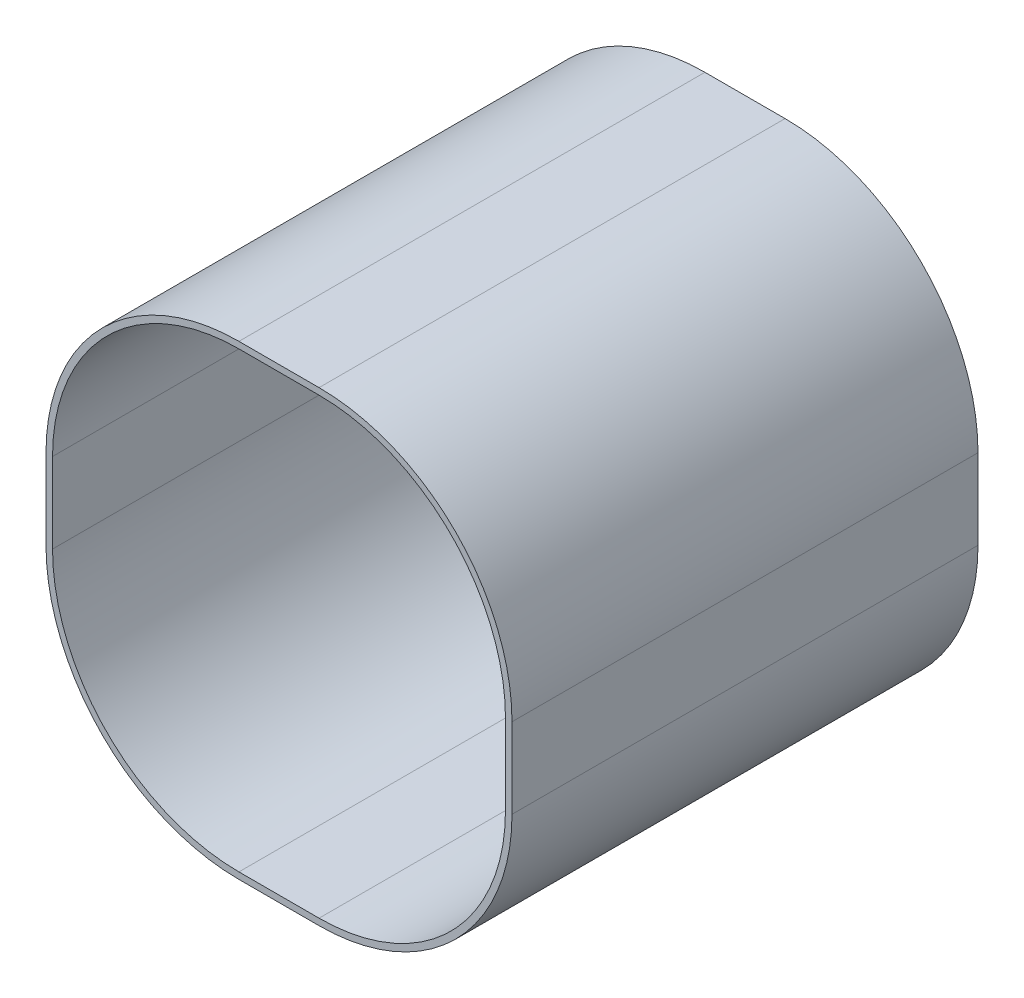
ISO-10303-21;
HEADER;
FILE_DESCRIPTION(('STEP AP214'),'2;1');
FILE_NAME('part.step','',(''),(''),'','','');
FILE_SCHEMA(('AUTOMOTIVE_DESIGN { 1 0 10303 214 1 1 1 1 }'));
ENDSEC;
DATA;
#1=APPLICATION_CONTEXT('core data for automotive mechanical design processes');
#2=APPLICATION_PROTOCOL_DEFINITION('international standard','automotive_design',2000,#1);
#3=PRODUCT_CONTEXT('',#1,'mechanical');
#4=PRODUCT('Part','Part','',(#3));
#5=PRODUCT_RELATED_PRODUCT_CATEGORY('part','',(#4));
#6=PRODUCT_DEFINITION_FORMATION('','',#4);
#7=PRODUCT_DEFINITION_CONTEXT('part definition',#1,'design');
#8=PRODUCT_DEFINITION('design','',#6,#7);
#9=PRODUCT_DEFINITION_SHAPE('','',#8);
#10=(LENGTH_UNIT() NAMED_UNIT(*) SI_UNIT(.MILLI.,.METRE.));
#11=(NAMED_UNIT(*) PLANE_ANGLE_UNIT() SI_UNIT($,.RADIAN.));
#12=(NAMED_UNIT(*) SI_UNIT($,.STERADIAN.) SOLID_ANGLE_UNIT());
#13=UNCERTAINTY_MEASURE_WITH_UNIT(LENGTH_MEASURE(1.E-05),#10,'distance_accuracy_value','');
#14=(GEOMETRIC_REPRESENTATION_CONTEXT(3) GLOBAL_UNCERTAINTY_ASSIGNED_CONTEXT((#13)) GLOBAL_UNIT_ASSIGNED_CONTEXT((#10,
#11,#12)) REPRESENTATION_CONTEXT('',''));
#15=CARTESIAN_POINT('',(0.,0.,0.));
#16=DIRECTION('',(0.,0.,1.));
#17=DIRECTION('',(1.,0.,0.));
#18=AXIS2_PLACEMENT_3D('',#15,#16,#17);
#19=CARTESIAN_POINT('',(0.,0.,25.));
#20=DIRECTION('',(0.,0.,1.));
#21=DIRECTION('',(1.,0.,0.));
#22=AXIS2_PLACEMENT_3D('',#19,#20,#21);
#23=PLANE('',#22);
#24=DIRECTION('',(0.,1.,0.));
#25=VECTOR('',#24,1.);
#26=CARTESIAN_POINT('',(12.5,12.5,25.));
#27=LINE('',#26,#25);
#28=CARTESIAN_POINT('',(12.5,-2.15,25.));
#29=VERTEX_POINT('',#28);
#30=CARTESIAN_POINT('',(12.5,2.15,25.));
#31=VERTEX_POINT('',#30);
#32=EDGE_CURVE('E251',#29,#31,#27,.T.);
#33=ORIENTED_EDGE('',*,*,#32,.T.);
#34=CARTESIAN_POINT('',(2.15,2.15,25.));
#35=DIRECTION('',(0.,0.,1.));
#36=DIRECTION('',(1.,0.,0.));
#37=AXIS2_PLACEMENT_3D('',#34,#35,#36);
#38=CIRCLE('',#37,10.35);
#39=CARTESIAN_POINT('',(2.15,12.5,25.));
#40=VERTEX_POINT('',#39);
#41=EDGE_CURVE('E230',#31,#40,#38,.T.);
#42=ORIENTED_EDGE('',*,*,#41,.T.);
#43=DIRECTION('',(-1.,0.,0.));
#44=VECTOR('',#43,1.);
#45=CARTESIAN_POINT('',(-12.5,12.5,25.));
#46=LINE('',#45,#44);
#47=CARTESIAN_POINT('',(-2.15,12.5,25.));
#48=VERTEX_POINT('',#47);
#49=EDGE_CURVE('E259',#40,#48,#46,.T.);
#50=ORIENTED_EDGE('',*,*,#49,.T.);
#51=CARTESIAN_POINT('',(-2.15,2.15,25.));
#52=DIRECTION('',(0.,0.,1.));
#53=DIRECTION('',(1.,0.,0.));
#54=AXIS2_PLACEMENT_3D('',#51,#52,#53);
#55=CIRCLE('',#54,10.35);
#56=CARTESIAN_POINT('',(-12.5,2.14999999999999,25.));
#57=VERTEX_POINT('',#56);
#58=EDGE_CURVE('E225',#48,#57,#55,.T.);
#59=ORIENTED_EDGE('',*,*,#58,.T.);
#60=DIRECTION('',(0.,-1.,0.));
#61=VECTOR('',#60,1.);
#62=CARTESIAN_POINT('',(-12.5,12.5,25.));
#63=LINE('',#62,#61);
#64=CARTESIAN_POINT('',(-12.5,-2.15000000000001,25.));
#65=VERTEX_POINT('',#64);
#66=EDGE_CURVE('E176',#57,#65,#63,.T.);
#67=ORIENTED_EDGE('',*,*,#66,.T.);
#68=CARTESIAN_POINT('',(-2.15,-2.15000000000001,25.));
#69=DIRECTION('',(0.,0.,1.));
#70=DIRECTION('',(1.,0.,0.));
#71=AXIS2_PLACEMENT_3D('',#68,#69,#70);
#72=CIRCLE('',#71,10.35);
#73=CARTESIAN_POINT('',(-2.15,-12.5,25.));
#74=VERTEX_POINT('',#73);
#75=EDGE_CURVE('E55',#65,#74,#72,.T.);
#76=ORIENTED_EDGE('',*,*,#75,.T.);
#77=DIRECTION('',(1.,0.,0.));
#78=VECTOR('',#77,1.);
#79=CARTESIAN_POINT('',(-12.5,-12.5,25.));
#80=LINE('',#79,#78);
#81=CARTESIAN_POINT('',(2.15,-12.5,25.));
#82=VERTEX_POINT('',#81);
#83=EDGE_CURVE('E172',#74,#82,#80,.T.);
#84=ORIENTED_EDGE('',*,*,#83,.T.);
#85=CARTESIAN_POINT('',(2.15,-2.15000000000001,25.));
#86=DIRECTION('',(0.,0.,1.));
#87=DIRECTION('',(1.,0.,0.));
#88=AXIS2_PLACEMENT_3D('',#85,#86,#87);
#89=CIRCLE('',#88,10.35);
#90=EDGE_CURVE('E228',#82,#29,#89,.T.);
#91=ORIENTED_EDGE('',*,*,#90,.T.);
#92=EDGE_LOOP('',(#33,#42,#50,#59,#67,#76,#84,#91));
#93=FACE_BOUND('',#92,.T.);
#94=DIRECTION('',(-1.,0.,0.));
#95=VECTOR('',#94,1.);
#96=CARTESIAN_POINT('',(-12.15,12.15,25.));
#97=LINE('',#96,#95);
#98=CARTESIAN_POINT('',(2.15,12.15,25.));
#99=VERTEX_POINT('',#98);
#100=CARTESIAN_POINT('',(-2.15,12.15,25.));
#101=VERTEX_POINT('',#100);
#102=EDGE_CURVE('E275',#99,#101,#97,.T.);
#103=ORIENTED_EDGE('',*,*,#102,.F.);
#104=CARTESIAN_POINT('',(2.15,2.15,25.));
#105=DIRECTION('',(0.,0.,1.));
#106=DIRECTION('',(1.,0.,0.));
#107=AXIS2_PLACEMENT_3D('',#104,#105,#106);
#108=CIRCLE('',#107,10.);
#109=CARTESIAN_POINT('',(12.15,2.15,25.));
#110=VERTEX_POINT('',#109);
#111=EDGE_CURVE('E201',#99,#110,#108,.F.);
#112=ORIENTED_EDGE('',*,*,#111,.T.);
#113=DIRECTION('',(0.,1.,0.));
#114=VECTOR('',#113,1.);
#115=CARTESIAN_POINT('',(12.15,12.15,25.));
#116=LINE('',#115,#114);
#117=CARTESIAN_POINT('',(12.15,-2.15,25.));
#118=VERTEX_POINT('',#117);
#119=EDGE_CURVE('E168',#118,#110,#116,.T.);
#120=ORIENTED_EDGE('',*,*,#119,.F.);
#121=CARTESIAN_POINT('',(2.15,-2.15,25.));
#122=DIRECTION('',(0.,0.,1.));
#123=DIRECTION('',(1.,0.,0.));
#124=AXIS2_PLACEMENT_3D('',#121,#122,#123);
#125=CIRCLE('',#124,10.);
#126=CARTESIAN_POINT('',(2.15,-12.15,25.));
#127=VERTEX_POINT('',#126);
#128=EDGE_CURVE('E197',#118,#127,#125,.F.);
#129=ORIENTED_EDGE('',*,*,#128,.T.);
#130=DIRECTION('',(1.,0.,0.));
#131=VECTOR('',#130,1.);
#132=CARTESIAN_POINT('',(-12.15,-12.15,25.));
#133=LINE('',#132,#131);
#134=CARTESIAN_POINT('',(-2.15,-12.15,25.));
#135=VERTEX_POINT('',#134);
#136=EDGE_CURVE('E256',#135,#127,#133,.T.);
#137=ORIENTED_EDGE('',*,*,#136,.F.);
#138=CARTESIAN_POINT('',(-2.15,-2.15,25.));
#139=DIRECTION('',(0.,0.,1.));
#140=DIRECTION('',(1.,0.,0.));
#141=AXIS2_PLACEMENT_3D('',#138,#139,#140);
#142=CIRCLE('',#141,10.);
#143=CARTESIAN_POINT('',(-12.15,-2.15,25.));
#144=VERTEX_POINT('',#143);
#145=EDGE_CURVE('E157',#135,#144,#142,.F.);
#146=ORIENTED_EDGE('',*,*,#145,.T.);
#147=DIRECTION('',(0.,-1.,0.));
#148=VECTOR('',#147,1.);
#149=CARTESIAN_POINT('',(-12.15,12.15,25.));
#150=LINE('',#149,#148);
#151=CARTESIAN_POINT('',(-12.15,2.14999999999999,25.));
#152=VERTEX_POINT('',#151);
#153=EDGE_CURVE('E272',#152,#144,#150,.T.);
#154=ORIENTED_EDGE('',*,*,#153,.F.);
#155=CARTESIAN_POINT('',(-2.15,2.15,25.));
#156=DIRECTION('',(0.,0.,1.));
#157=DIRECTION('',(1.,0.,0.));
#158=AXIS2_PLACEMENT_3D('',#155,#156,#157);
#159=CIRCLE('',#158,10.);
#160=EDGE_CURVE('E158',#152,#101,#159,.F.);
#161=ORIENTED_EDGE('',*,*,#160,.T.);
#162=EDGE_LOOP('',(#103,#112,#120,#129,#137,#146,#154,#161));
#163=FACE_BOUND('',#162,.T.);
#164=ADVANCED_FACE('F33',(#93,#163),#23,.T.);
#165=CARTESIAN_POINT('',(0.,0.,0.));
#166=DIRECTION('',(0.,0.,1.));
#167=DIRECTION('',(1.,0.,0.));
#168=AXIS2_PLACEMENT_3D('',#165,#166,#167);
#169=PLANE('',#168);
#170=DIRECTION('',(-1.,0.,0.));
#171=VECTOR('',#170,1.);
#172=CARTESIAN_POINT('',(-12.5,12.5,0.));
#173=LINE('',#172,#171);
#174=CARTESIAN_POINT('',(2.15,12.5,0.));
#175=VERTEX_POINT('',#174);
#176=CARTESIAN_POINT('',(-2.15,12.5,0.));
#177=VERTEX_POINT('',#176);
#178=EDGE_CURVE('E250',#175,#177,#173,.T.);
#179=ORIENTED_EDGE('',*,*,#178,.F.);
#180=CARTESIAN_POINT('',(2.15,2.15,0.));
#181=DIRECTION('',(0.,0.,1.));
#182=DIRECTION('',(1.,0.,0.));
#183=AXIS2_PLACEMENT_3D('',#180,#181,#182);
#184=CIRCLE('',#183,10.35);
#185=CARTESIAN_POINT('',(12.5,2.15,0.));
#186=VERTEX_POINT('',#185);
#187=EDGE_CURVE('E218',#175,#186,#184,.F.);
#188=ORIENTED_EDGE('',*,*,#187,.T.);
#189=DIRECTION('',(0.,1.,0.));
#190=VECTOR('',#189,1.);
#191=CARTESIAN_POINT('',(12.5,12.5,0.));
#192=LINE('',#191,#190);
#193=CARTESIAN_POINT('',(12.5,-2.15,0.));
#194=VERTEX_POINT('',#193);
#195=EDGE_CURVE('E252',#194,#186,#192,.T.);
#196=ORIENTED_EDGE('',*,*,#195,.F.);
#197=CARTESIAN_POINT('',(2.15,-2.15000000000001,0.));
#198=DIRECTION('',(0.,0.,1.));
#199=DIRECTION('',(1.,0.,0.));
#200=AXIS2_PLACEMENT_3D('',#197,#198,#199);
#201=CIRCLE('',#200,10.35);
#202=CARTESIAN_POINT('',(2.15,-12.5,0.));
#203=VERTEX_POINT('',#202);
#204=EDGE_CURVE('E216',#194,#203,#201,.F.);
#205=ORIENTED_EDGE('',*,*,#204,.T.);
#206=DIRECTION('',(1.,0.,0.));
#207=VECTOR('',#206,1.);
#208=CARTESIAN_POINT('',(-12.5,-12.5,0.));
#209=LINE('',#208,#207);
#210=CARTESIAN_POINT('',(-2.15,-12.5,0.));
#211=VERTEX_POINT('',#210);
#212=EDGE_CURVE('E179',#211,#203,#209,.T.);
#213=ORIENTED_EDGE('',*,*,#212,.F.);
#214=CARTESIAN_POINT('',(-2.15,-2.15000000000001,0.));
#215=DIRECTION('',(0.,0.,1.));
#216=DIRECTION('',(1.,0.,0.));
#217=AXIS2_PLACEMENT_3D('',#214,#215,#216);
#218=CIRCLE('',#217,10.35);
#219=CARTESIAN_POINT('',(-12.5,-2.15000000000001,0.));
#220=VERTEX_POINT('',#219);
#221=EDGE_CURVE('E214',#211,#220,#218,.F.);
#222=ORIENTED_EDGE('',*,*,#221,.T.);
#223=DIRECTION('',(0.,-1.,0.));
#224=VECTOR('',#223,1.);
#225=CARTESIAN_POINT('',(-12.5,12.5,0.));
#226=LINE('',#225,#224);
#227=CARTESIAN_POINT('',(-12.5,2.14999999999999,0.));
#228=VERTEX_POINT('',#227);
#229=EDGE_CURVE('E242',#228,#220,#226,.T.);
#230=ORIENTED_EDGE('',*,*,#229,.F.);
#231=CARTESIAN_POINT('',(-2.15,2.15,0.));
#232=DIRECTION('',(0.,0.,1.));
#233=DIRECTION('',(1.,0.,0.));
#234=AXIS2_PLACEMENT_3D('',#231,#232,#233);
#235=CIRCLE('',#234,10.35);
#236=EDGE_CURVE('E212',#228,#177,#235,.F.);
#237=ORIENTED_EDGE('',*,*,#236,.T.);
#238=EDGE_LOOP('',(#179,#188,#196,#205,#213,#222,#230,#237));
#239=FACE_BOUND('',#238,.T.);
#240=DIRECTION('',(1.,0.,0.));
#241=VECTOR('',#240,1.);
#242=CARTESIAN_POINT('',(-12.15,-12.15,0.));
#243=LINE('',#242,#241);
#244=CARTESIAN_POINT('',(-2.15,-12.15,0.));
#245=VERTEX_POINT('',#244);
#246=CARTESIAN_POINT('',(2.15,-12.15,0.));
#247=VERTEX_POINT('',#246);
#248=EDGE_CURVE('E150',#245,#247,#243,.T.);
#249=ORIENTED_EDGE('',*,*,#248,.T.);
#250=CARTESIAN_POINT('',(2.15,-2.15,0.));
#251=DIRECTION('',(0.,0.,1.));
#252=DIRECTION('',(1.,0.,0.));
#253=AXIS2_PLACEMENT_3D('',#250,#251,#252);
#254=CIRCLE('',#253,10.);
#255=CARTESIAN_POINT('',(12.15,-2.15,0.));
#256=VERTEX_POINT('',#255);
#257=EDGE_CURVE('E195',#247,#256,#254,.T.);
#258=ORIENTED_EDGE('',*,*,#257,.T.);
#259=DIRECTION('',(0.,1.,0.));
#260=VECTOR('',#259,1.);
#261=CARTESIAN_POINT('',(12.15,12.15,0.));
#262=LINE('',#261,#260);
#263=CARTESIAN_POINT('',(12.15,2.15,0.));
#264=VERTEX_POINT('',#263);
#265=EDGE_CURVE('E268',#256,#264,#262,.T.);
#266=ORIENTED_EDGE('',*,*,#265,.T.);
#267=CARTESIAN_POINT('',(2.15,2.15,0.));
#268=DIRECTION('',(0.,0.,1.));
#269=DIRECTION('',(1.,0.,0.));
#270=AXIS2_PLACEMENT_3D('',#267,#268,#269);
#271=CIRCLE('',#270,10.);
#272=CARTESIAN_POINT('',(2.15,12.15,0.));
#273=VERTEX_POINT('',#272);
#274=EDGE_CURVE('E199',#264,#273,#271,.T.);
#275=ORIENTED_EDGE('',*,*,#274,.T.);
#276=DIRECTION('',(-1.,0.,0.));
#277=VECTOR('',#276,1.);
#278=CARTESIAN_POINT('',(-12.15,12.15,0.));
#279=LINE('',#278,#277);
#280=CARTESIAN_POINT('',(-2.15,12.15,0.));
#281=VERTEX_POINT('',#280);
#282=EDGE_CURVE('E265',#273,#281,#279,.T.);
#283=ORIENTED_EDGE('',*,*,#282,.T.);
#284=CARTESIAN_POINT('',(-2.15,2.15,0.));
#285=DIRECTION('',(0.,0.,1.));
#286=DIRECTION('',(1.,0.,0.));
#287=AXIS2_PLACEMENT_3D('',#284,#285,#286);
#288=CIRCLE('',#287,10.);
#289=CARTESIAN_POINT('',(-12.15,2.14999999999999,0.));
#290=VERTEX_POINT('',#289);
#291=EDGE_CURVE('E203',#281,#290,#288,.T.);
#292=ORIENTED_EDGE('',*,*,#291,.T.);
#293=DIRECTION('',(0.,-1.,0.));
#294=VECTOR('',#293,1.);
#295=CARTESIAN_POINT('',(-12.15,12.15,0.));
#296=LINE('',#295,#294);
#297=CARTESIAN_POINT('',(-12.15,-2.15,0.));
#298=VERTEX_POINT('',#297);
#299=EDGE_CURVE('E152',#290,#298,#296,.T.);
#300=ORIENTED_EDGE('',*,*,#299,.T.);
#301=CARTESIAN_POINT('',(-2.15,-2.15,0.));
#302=DIRECTION('',(0.,0.,1.));
#303=DIRECTION('',(1.,0.,0.));
#304=AXIS2_PLACEMENT_3D('',#301,#302,#303);
#305=CIRCLE('',#304,10.);
#306=EDGE_CURVE('E147',#298,#245,#305,.T.);
#307=ORIENTED_EDGE('',*,*,#306,.T.);
#308=EDGE_LOOP('',(#249,#258,#266,#275,#283,#292,#300,#307));
#309=FACE_BOUND('',#308,.T.);
#310=ADVANCED_FACE('F149',(#239,#309),#169,.F.);
#311=CARTESIAN_POINT('',(12.5,12.5,25.));
#312=DIRECTION('',(-1.,0.,0.));
#313=DIRECTION('',(0.,-1.,0.));
#314=AXIS2_PLACEMENT_3D('',#311,#312,#313);
#315=PLANE('',#314);
#316=ORIENTED_EDGE('',*,*,#195,.T.);
#317=DIRECTION('',(0.,0.,-1.));
#318=VECTOR('',#317,1.);
#319=CARTESIAN_POINT('',(12.5,2.15,25.));
#320=LINE('',#319,#318);
#321=EDGE_CURVE('E223',#186,#31,#320,.F.);
#322=ORIENTED_EDGE('',*,*,#321,.T.);
#323=ORIENTED_EDGE('',*,*,#32,.F.);
#324=DIRECTION('',(0.,0.,-1.));
#325=VECTOR('',#324,1.);
#326=CARTESIAN_POINT('',(12.5,-2.15,25.));
#327=LINE('',#326,#325);
#328=EDGE_CURVE('E220',#29,#194,#327,.T.);
#329=ORIENTED_EDGE('',*,*,#328,.T.);
#330=EDGE_LOOP('',(#316,#322,#323,#329));
#331=FACE_BOUND('',#330,.T.);
#332=ADVANCED_FACE('F321',(#331),#315,.F.);
#333=CARTESIAN_POINT('',(-12.5,12.5,25.));
#334=DIRECTION('',(0.,-1.,0.));
#335=DIRECTION('',(0.,0.,-1.));
#336=AXIS2_PLACEMENT_3D('',#333,#334,#335);
#337=PLANE('',#336);
#338=ORIENTED_EDGE('',*,*,#49,.F.);
#339=DIRECTION('',(0.,0.,-1.));
#340=VECTOR('',#339,1.);
#341=CARTESIAN_POINT('',(2.15,12.5,25.));
#342=LINE('',#341,#340);
#343=EDGE_CURVE('E209',#40,#175,#342,.T.);
#344=ORIENTED_EDGE('',*,*,#343,.T.);
#345=ORIENTED_EDGE('',*,*,#178,.T.);
#346=DIRECTION('',(0.,0.,-1.));
#347=VECTOR('',#346,1.);
#348=CARTESIAN_POINT('',(-2.15,12.5,25.));
#349=LINE('',#348,#347);
#350=EDGE_CURVE('E207',#177,#48,#349,.F.);
#351=ORIENTED_EDGE('',*,*,#350,.T.);
#352=EDGE_LOOP('',(#338,#344,#345,#351));
#353=FACE_BOUND('',#352,.T.);
#354=ADVANCED_FACE('F331',(#353),#337,.F.);
#355=CARTESIAN_POINT('',(-12.5,12.5,25.));
#356=DIRECTION('',(1.,0.,0.));
#357=DIRECTION('',(0.,1.,0.));
#358=AXIS2_PLACEMENT_3D('',#355,#356,#357);
#359=PLANE('',#358);
#360=ORIENTED_EDGE('',*,*,#229,.T.);
#361=DIRECTION('',(0.,0.,-1.));
#362=VECTOR('',#361,1.);
#363=CARTESIAN_POINT('',(-12.5,-2.15000000000001,25.));
#364=LINE('',#363,#362);
#365=EDGE_CURVE('E11',#220,#65,#364,.F.);
#366=ORIENTED_EDGE('',*,*,#365,.T.);
#367=ORIENTED_EDGE('',*,*,#66,.F.);
#368=DIRECTION('',(0.,0.,-1.));
#369=VECTOR('',#368,1.);
#370=CARTESIAN_POINT('',(-12.5,2.14999999999999,25.));
#371=LINE('',#370,#369);
#372=EDGE_CURVE('E41',#57,#228,#371,.T.);
#373=ORIENTED_EDGE('',*,*,#372,.T.);
#374=EDGE_LOOP('',(#360,#366,#367,#373));
#375=FACE_BOUND('',#374,.T.);
#376=ADVANCED_FACE('F241',(#375),#359,.F.);
#377=CARTESIAN_POINT('',(-12.5,-12.5,25.));
#378=DIRECTION('',(0.,1.,0.));
#379=DIRECTION('',(0.,0.,1.));
#380=AXIS2_PLACEMENT_3D('',#377,#378,#379);
#381=PLANE('',#380);
#382=ORIENTED_EDGE('',*,*,#212,.T.);
#383=DIRECTION('',(0.,0.,-1.));
#384=VECTOR('',#383,1.);
#385=CARTESIAN_POINT('',(2.15,-12.5,25.));
#386=LINE('',#385,#384);
#387=EDGE_CURVE('E48',#203,#82,#386,.F.);
#388=ORIENTED_EDGE('',*,*,#387,.T.);
#389=ORIENTED_EDGE('',*,*,#83,.F.);
#390=DIRECTION('',(0.,0.,-1.));
#391=VECTOR('',#390,1.);
#392=CARTESIAN_POINT('',(-2.15,-12.5,25.));
#393=LINE('',#392,#391);
#394=EDGE_CURVE('E232',#74,#211,#393,.T.);
#395=ORIENTED_EDGE('',*,*,#394,.T.);
#396=EDGE_LOOP('',(#382,#388,#389,#395));
#397=FACE_BOUND('',#396,.T.);
#398=ADVANCED_FACE('F326',(#397),#381,.F.);
#399=CARTESIAN_POINT('',(12.15,12.15,25.));
#400=DIRECTION('',(-1.,0.,0.));
#401=DIRECTION('',(0.,-1.,0.));
#402=AXIS2_PLACEMENT_3D('',#399,#400,#401);
#403=PLANE('',#402);
#404=ORIENTED_EDGE('',*,*,#265,.F.);
#405=DIRECTION('',(0.,0.,-1.));
#406=VECTOR('',#405,1.);
#407=CARTESIAN_POINT('',(12.15,-2.15,25.));
#408=LINE('',#407,#406);
#409=EDGE_CURVE('E184',#256,#118,#408,.F.);
#410=ORIENTED_EDGE('',*,*,#409,.T.);
#411=ORIENTED_EDGE('',*,*,#119,.T.);
#412=DIRECTION('',(0.,0.,-1.));
#413=VECTOR('',#412,1.);
#414=CARTESIAN_POINT('',(12.15,2.15,0.));
#415=LINE('',#414,#413);
#416=EDGE_CURVE('E174',#110,#264,#415,.T.);
#417=ORIENTED_EDGE('',*,*,#416,.T.);
#418=EDGE_LOOP('',(#404,#410,#411,#417));
#419=FACE_BOUND('',#418,.T.);
#420=ADVANCED_FACE('F283',(#419),#403,.T.);
#421=CARTESIAN_POINT('',(-12.15,12.15,25.));
#422=DIRECTION('',(0.,-1.,0.));
#423=DIRECTION('',(0.,0.,-1.));
#424=AXIS2_PLACEMENT_3D('',#421,#422,#423);
#425=PLANE('',#424);
#426=ORIENTED_EDGE('',*,*,#282,.F.);
#427=DIRECTION('',(0.,0.,-1.));
#428=VECTOR('',#427,1.);
#429=CARTESIAN_POINT('',(2.15,12.15,25.));
#430=LINE('',#429,#428);
#431=EDGE_CURVE('E189',#273,#99,#430,.F.);
#432=ORIENTED_EDGE('',*,*,#431,.T.);
#433=ORIENTED_EDGE('',*,*,#102,.T.);
#434=DIRECTION('',(0.,0.,-1.));
#435=VECTOR('',#434,1.);
#436=CARTESIAN_POINT('',(-2.15,12.15,0.));
#437=LINE('',#436,#435);
#438=EDGE_CURVE('E186',#101,#281,#437,.T.);
#439=ORIENTED_EDGE('',*,*,#438,.T.);
#440=EDGE_LOOP('',(#426,#432,#433,#439));
#441=FACE_BOUND('',#440,.T.);
#442=ADVANCED_FACE('F293',(#441),#425,.T.);
#443=CARTESIAN_POINT('',(-12.15,12.15,25.));
#444=DIRECTION('',(1.,0.,0.));
#445=DIRECTION('',(0.,1.,0.));
#446=AXIS2_PLACEMENT_3D('',#443,#444,#445);
#447=PLANE('',#446);
#448=ORIENTED_EDGE('',*,*,#299,.F.);
#449=DIRECTION('',(0.,0.,-1.));
#450=VECTOR('',#449,1.);
#451=CARTESIAN_POINT('',(-12.15,2.14999999999999,25.));
#452=LINE('',#451,#450);
#453=EDGE_CURVE('E193',#290,#152,#452,.F.);
#454=ORIENTED_EDGE('',*,*,#453,.T.);
#455=ORIENTED_EDGE('',*,*,#153,.T.);
#456=DIRECTION('',(0.,0.,-1.));
#457=VECTOR('',#456,1.);
#458=CARTESIAN_POINT('',(-12.15,-2.15,0.));
#459=LINE('',#458,#457);
#460=EDGE_CURVE('E191',#144,#298,#459,.T.);
#461=ORIENTED_EDGE('',*,*,#460,.T.);
#462=EDGE_LOOP('',(#448,#454,#455,#461));
#463=FACE_BOUND('',#462,.T.);
#464=ADVANCED_FACE('F301',(#463),#447,.T.);
#465=CARTESIAN_POINT('',(-12.15,-12.15,25.));
#466=DIRECTION('',(0.,1.,0.));
#467=DIRECTION('',(0.,0.,1.));
#468=AXIS2_PLACEMENT_3D('',#465,#466,#467);
#469=PLANE('',#468);
#470=ORIENTED_EDGE('',*,*,#136,.T.);
#471=DIRECTION('',(0.,0.,-1.));
#472=VECTOR('',#471,1.);
#473=CARTESIAN_POINT('',(2.15,-12.15,0.));
#474=LINE('',#473,#472);
#475=EDGE_CURVE('E167',#127,#247,#474,.T.);
#476=ORIENTED_EDGE('',*,*,#475,.T.);
#477=ORIENTED_EDGE('',*,*,#248,.F.);
#478=DIRECTION('',(0.,0.,-1.));
#479=VECTOR('',#478,1.);
#480=CARTESIAN_POINT('',(-2.15,-12.15,25.));
#481=LINE('',#480,#479);
#482=EDGE_CURVE('E164',#245,#135,#481,.F.);
#483=ORIENTED_EDGE('',*,*,#482,.T.);
#484=EDGE_LOOP('',(#470,#476,#477,#483));
#485=FACE_BOUND('',#484,.T.);
#486=ADVANCED_FACE('F163',(#485),#469,.T.);
#487=CARTESIAN_POINT('',(2.15,-2.15,25.));
#488=DIRECTION('',(0.,0.,1.));
#489=DIRECTION('',(1.,0.,0.));
#490=AXIS2_PLACEMENT_3D('',#487,#488,#489);
#491=CYLINDRICAL_SURFACE('',#490,10.);
#492=ORIENTED_EDGE('',*,*,#128,.F.);
#493=ORIENTED_EDGE('',*,*,#409,.F.);
#494=ORIENTED_EDGE('',*,*,#257,.F.);
#495=ORIENTED_EDGE('',*,*,#475,.F.);
#496=EDGE_LOOP('',(#492,#493,#494,#495));
#497=FACE_BOUND('',#496,.T.);
#498=ADVANCED_FACE('F304',(#497),#491,.F.);
#499=CARTESIAN_POINT('',(2.15,2.15,25.));
#500=DIRECTION('',(0.,0.,1.));
#501=DIRECTION('',(1.,0.,0.));
#502=AXIS2_PLACEMENT_3D('',#499,#500,#501);
#503=CYLINDRICAL_SURFACE('',#502,10.);
#504=ORIENTED_EDGE('',*,*,#111,.F.);
#505=ORIENTED_EDGE('',*,*,#431,.F.);
#506=ORIENTED_EDGE('',*,*,#274,.F.);
#507=ORIENTED_EDGE('',*,*,#416,.F.);
#508=EDGE_LOOP('',(#504,#505,#506,#507));
#509=FACE_BOUND('',#508,.T.);
#510=ADVANCED_FACE('F289',(#509),#503,.F.);
#511=CARTESIAN_POINT('',(-2.15,2.15,25.));
#512=DIRECTION('',(0.,0.,1.));
#513=DIRECTION('',(1.,0.,0.));
#514=AXIS2_PLACEMENT_3D('',#511,#512,#513);
#515=CYLINDRICAL_SURFACE('',#514,10.);
#516=ORIENTED_EDGE('',*,*,#160,.F.);
#517=ORIENTED_EDGE('',*,*,#453,.F.);
#518=ORIENTED_EDGE('',*,*,#291,.F.);
#519=ORIENTED_EDGE('',*,*,#438,.F.);
#520=EDGE_LOOP('',(#516,#517,#518,#519));
#521=FACE_BOUND('',#520,.T.);
#522=ADVANCED_FACE('F298',(#521),#515,.F.);
#523=CARTESIAN_POINT('',(-2.15,-2.15,25.));
#524=DIRECTION('',(0.,0.,1.));
#525=DIRECTION('',(1.,0.,0.));
#526=AXIS2_PLACEMENT_3D('',#523,#524,#525);
#527=CYLINDRICAL_SURFACE('',#526,10.);
#528=ORIENTED_EDGE('',*,*,#145,.F.);
#529=ORIENTED_EDGE('',*,*,#482,.F.);
#530=ORIENTED_EDGE('',*,*,#306,.F.);
#531=ORIENTED_EDGE('',*,*,#460,.F.);
#532=EDGE_LOOP('',(#528,#529,#530,#531));
#533=FACE_BOUND('',#532,.T.);
#534=ADVANCED_FACE('F171',(#533),#527,.F.);
#535=CARTESIAN_POINT('',(2.15,2.15,25.));
#536=DIRECTION('',(0.,0.,-1.));
#537=DIRECTION('',(-1.,0.,0.));
#538=AXIS2_PLACEMENT_3D('',#535,#536,#537);
#539=CYLINDRICAL_SURFACE('',#538,10.35);
#540=ORIENTED_EDGE('',*,*,#41,.F.);
#541=ORIENTED_EDGE('',*,*,#321,.F.);
#542=ORIENTED_EDGE('',*,*,#187,.F.);
#543=ORIENTED_EDGE('',*,*,#343,.F.);
#544=EDGE_LOOP('',(#540,#541,#542,#543));
#545=FACE_BOUND('',#544,.T.);
#546=ADVANCED_FACE('F344',(#545),#539,.T.);
#547=CARTESIAN_POINT('',(2.15,-2.15000000000001,25.));
#548=DIRECTION('',(0.,0.,-1.));
#549=DIRECTION('',(-1.,0.,0.));
#550=AXIS2_PLACEMENT_3D('',#547,#548,#549);
#551=CYLINDRICAL_SURFACE('',#550,10.35);
#552=ORIENTED_EDGE('',*,*,#90,.F.);
#553=ORIENTED_EDGE('',*,*,#387,.F.);
#554=ORIENTED_EDGE('',*,*,#204,.F.);
#555=ORIENTED_EDGE('',*,*,#328,.F.);
#556=EDGE_LOOP('',(#552,#553,#554,#555));
#557=FACE_BOUND('',#556,.T.);
#558=ADVANCED_FACE('F353',(#557),#551,.T.);
#559=CARTESIAN_POINT('',(-2.15,-2.15000000000001,25.));
#560=DIRECTION('',(0.,0.,-1.));
#561=DIRECTION('',(-1.,0.,0.));
#562=AXIS2_PLACEMENT_3D('',#559,#560,#561);
#563=CYLINDRICAL_SURFACE('',#562,10.35);
#564=ORIENTED_EDGE('',*,*,#75,.F.);
#565=ORIENTED_EDGE('',*,*,#365,.F.);
#566=ORIENTED_EDGE('',*,*,#221,.F.);
#567=ORIENTED_EDGE('',*,*,#394,.F.);
#568=EDGE_LOOP('',(#564,#565,#566,#567));
#569=FACE_BOUND('',#568,.T.);
#570=ADVANCED_FACE('F350',(#569),#563,.T.);
#571=CARTESIAN_POINT('',(-2.15,2.15,25.));
#572=DIRECTION('',(0.,0.,-1.));
#573=DIRECTION('',(-1.,0.,0.));
#574=AXIS2_PLACEMENT_3D('',#571,#572,#573);
#575=CYLINDRICAL_SURFACE('',#574,10.35);
#576=ORIENTED_EDGE('',*,*,#58,.F.);
#577=ORIENTED_EDGE('',*,*,#350,.F.);
#578=ORIENTED_EDGE('',*,*,#236,.F.);
#579=ORIENTED_EDGE('',*,*,#372,.F.);
#580=EDGE_LOOP('',(#576,#577,#578,#579));
#581=FACE_BOUND('',#580,.T.);
#582=ADVANCED_FACE('F35',(#581),#575,.T.);
#583=CLOSED_SHELL('',(#164,#310,#332,#354,#376,#398,#420,#442,#464,#486,#498,#510,#522,#534,
#546,#558,#570,#582));
#584=MANIFOLD_SOLID_BREP('B2',#583);
#585=ADVANCED_BREP_SHAPE_REPRESENTATION('',(#18,#584),#14);
#586=SHAPE_DEFINITION_REPRESENTATION(#9,#585);
ENDSEC;
END-ISO-10303-21;
